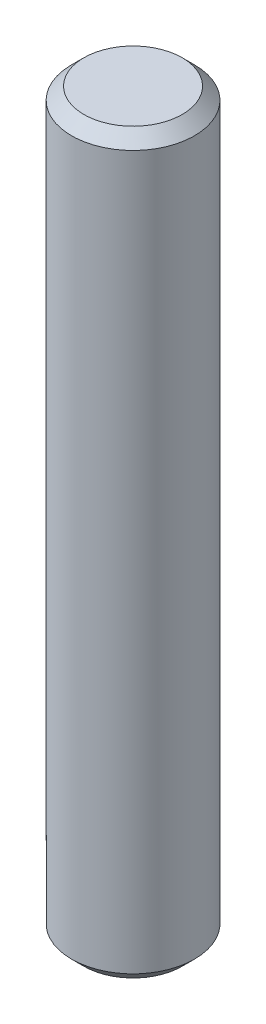
ISO-10303-21;
HEADER;
FILE_DESCRIPTION(('STEP AP214'),'2;1');
FILE_NAME('part.step','',(''),(''),'','','');
FILE_SCHEMA(('AUTOMOTIVE_DESIGN { 1 0 10303 214 1 1 1 1 }'));
ENDSEC;
DATA;
#1=APPLICATION_CONTEXT('core data for automotive mechanical design processes');
#2=APPLICATION_PROTOCOL_DEFINITION('international standard','automotive_design',2000,#1);
#3=PRODUCT_CONTEXT('',#1,'mechanical');
#4=PRODUCT('Part','Part','',(#3));
#5=PRODUCT_RELATED_PRODUCT_CATEGORY('part','',(#4));
#6=PRODUCT_DEFINITION_FORMATION('','',#4);
#7=PRODUCT_DEFINITION_CONTEXT('part definition',#1,'design');
#8=PRODUCT_DEFINITION('design','',#6,#7);
#9=PRODUCT_DEFINITION_SHAPE('','',#8);
#10=(LENGTH_UNIT() NAMED_UNIT(*) SI_UNIT(.MILLI.,.METRE.));
#11=(NAMED_UNIT(*) PLANE_ANGLE_UNIT() SI_UNIT($,.RADIAN.));
#12=(NAMED_UNIT(*) SI_UNIT($,.STERADIAN.) SOLID_ANGLE_UNIT());
#13=UNCERTAINTY_MEASURE_WITH_UNIT(LENGTH_MEASURE(1.E-05),#10,'distance_accuracy_value','');
#14=(GEOMETRIC_REPRESENTATION_CONTEXT(3) GLOBAL_UNCERTAINTY_ASSIGNED_CONTEXT((#13)) GLOBAL_UNIT_ASSIGNED_CONTEXT((#10,
#11,#12)) REPRESENTATION_CONTEXT('',''));
#15=CARTESIAN_POINT('',(0.,0.,0.));
#16=DIRECTION('',(0.,0.,1.));
#17=DIRECTION('',(1.,0.,0.));
#18=AXIS2_PLACEMENT_3D('',#15,#16,#17);
#19=CARTESIAN_POINT('',(0.,3.,0.));
#20=DIRECTION('',(0.,1.,0.));
#21=DIRECTION('',(0.,0.,1.));
#22=AXIS2_PLACEMENT_3D('',#19,#20,#21);
#23=PLANE('',#22);
#24=CARTESIAN_POINT('',(0.,3.00000000004275,0.));
#25=DIRECTION('',(0.,-1.,0.));
#26=DIRECTION('',(0.,0.,-1.));
#27=AXIS2_PLACEMENT_3D('',#24,#25,#26);
#28=CIRCLE('',#27,0.399999999956435);
#29=CARTESIAN_POINT('',(0.,3.00000000004275,-0.399999999956435));
#30=VERTEX_POINT('',#29);
#31=EDGE_CURVE('E18',#30,#30,#28,.T.);
#32=ORIENTED_EDGE('',*,*,#31,.F.);
#33=EDGE_LOOP('',(#32));
#34=FACE_BOUND('',#33,.T.);
#35=ADVANCED_FACE('F15',(#34),#23,.T.);
#36=CARTESIAN_POINT('',(0.,-3.,0.));
#37=DIRECTION('',(0.,1.,0.));
#38=DIRECTION('',(0.,0.,1.));
#39=AXIS2_PLACEMENT_3D('',#36,#37,#38);
#40=PLANE('',#39);
#41=CARTESIAN_POINT('',(0.,-2.9999999999859,0.));
#42=DIRECTION('',(0.,1.,0.));
#43=DIRECTION('',(0.,0.,1.));
#44=AXIS2_PLACEMENT_3D('',#41,#42,#43);
#45=CIRCLE('',#44,0.400000000070122);
#46=CARTESIAN_POINT('',(0.,-2.9999999999859,0.400000000070122));
#47=VERTEX_POINT('',#46);
#48=EDGE_CURVE('E27',#47,#47,#45,.T.);
#49=ORIENTED_EDGE('',*,*,#48,.F.);
#50=EDGE_LOOP('',(#49));
#51=FACE_BOUND('',#50,.T.);
#52=ADVANCED_FACE('F38',(#51),#40,.F.);
#53=CARTESIAN_POINT('',(0.,2.90000000012469,0.));
#54=DIRECTION('',(0.,-1.,0.));
#55=DIRECTION('',(0.,0.,-1.));
#56=AXIS2_PLACEMENT_3D('',#53,#54,#55);
#57=CONICAL_SURFACE('',#56,0.49999999987449,0.785398163397448);
#58=CARTESIAN_POINT('',(0.,2.9,0.));
#59=DIRECTION('',(0.,-1.,0.));
#60=DIRECTION('',(0.,0.,-1.));
#61=AXIS2_PLACEMENT_3D('',#58,#59,#60);
#62=CIRCLE('',#61,0.5);
#63=CARTESIAN_POINT('',(0.,2.9,-0.5));
#64=VERTEX_POINT('',#63);
#65=EDGE_CURVE('E22',#64,#64,#62,.T.);
#66=ORIENTED_EDGE('',*,*,#65,.F.);
#67=EDGE_LOOP('',(#66));
#68=FACE_BOUND('',#67,.T.);
#69=ORIENTED_EDGE('',*,*,#31,.T.);
#70=EDGE_LOOP('',(#69));
#71=FACE_BOUND('',#70,.T.);
#72=ADVANCED_FACE('F35',(#68,#71),#57,.T.);
#73=CARTESIAN_POINT('',(0.,-2.90000000023838,0.));
#74=DIRECTION('',(0.,1.,0.));
#75=DIRECTION('',(0.,0.,1.));
#76=AXIS2_PLACEMENT_3D('',#73,#74,#75);
#77=CONICAL_SURFACE('',#76,0.499999999817646,0.785398163397448);
#78=CARTESIAN_POINT('',(0.,-2.9,0.));
#79=DIRECTION('',(0.,-1.,0.));
#80=DIRECTION('',(0.,0.,-1.));
#81=AXIS2_PLACEMENT_3D('',#78,#79,#80);
#82=CIRCLE('',#81,0.5);
#83=CARTESIAN_POINT('',(0.,-2.9,-0.5));
#84=VERTEX_POINT('',#83);
#85=EDGE_CURVE('E10',#84,#84,#82,.F.);
#86=ORIENTED_EDGE('',*,*,#85,.F.);
#87=EDGE_LOOP('',(#86));
#88=FACE_BOUND('',#87,.T.);
#89=ORIENTED_EDGE('',*,*,#48,.T.);
#90=EDGE_LOOP('',(#89));
#91=FACE_BOUND('',#90,.T.);
#92=ADVANCED_FACE('F46',(#88,#91),#77,.T.);
#93=CARTESIAN_POINT('',(0.,3.,0.));
#94=DIRECTION('',(0.,-1.,0.));
#95=DIRECTION('',(0.,0.,-1.));
#96=AXIS2_PLACEMENT_3D('',#93,#94,#95);
#97=CYLINDRICAL_SURFACE('',#96,0.5);
#98=ORIENTED_EDGE('',*,*,#85,.T.);
#99=EDGE_LOOP('',(#98));
#100=FACE_BOUND('',#99,.T.);
#101=ORIENTED_EDGE('',*,*,#65,.T.);
#102=EDGE_LOOP('',(#101));
#103=FACE_BOUND('',#102,.T.);
#104=ADVANCED_FACE('F44',(#100,#103),#97,.T.);
#105=CLOSED_SHELL('',(#35,#52,#72,#92,#104));
#106=MANIFOLD_SOLID_BREP('B1',#105);
#107=ADVANCED_BREP_SHAPE_REPRESENTATION('',(#18,#106),#14);
#108=SHAPE_DEFINITION_REPRESENTATION(#9,#107);
ENDSEC;
END-ISO-10303-21;
